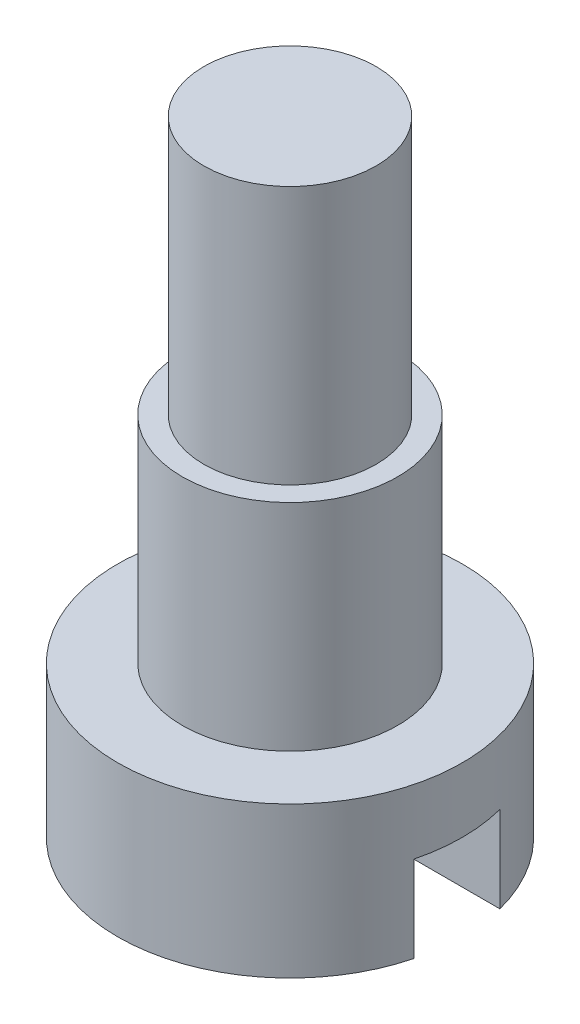
ISO-10303-21;
HEADER;
FILE_DESCRIPTION(('STEP AP214'),'2;1');
FILE_NAME('part.step','',(''),(''),'','','');
FILE_SCHEMA(('AUTOMOTIVE_DESIGN { 1 0 10303 214 1 1 1 1 }'));
ENDSEC;
DATA;
#1=APPLICATION_CONTEXT('core data for automotive mechanical design processes');
#2=APPLICATION_PROTOCOL_DEFINITION('international standard','automotive_design',2000,#1);
#3=PRODUCT_CONTEXT('',#1,'mechanical');
#4=PRODUCT('Part','Part','',(#3));
#5=PRODUCT_RELATED_PRODUCT_CATEGORY('part','',(#4));
#6=PRODUCT_DEFINITION_FORMATION('','',#4);
#7=PRODUCT_DEFINITION_CONTEXT('part definition',#1,'design');
#8=PRODUCT_DEFINITION('design','',#6,#7);
#9=PRODUCT_DEFINITION_SHAPE('','',#8);
#10=(LENGTH_UNIT() NAMED_UNIT(*) SI_UNIT(.MILLI.,.METRE.));
#11=(NAMED_UNIT(*) PLANE_ANGLE_UNIT() SI_UNIT($,.RADIAN.));
#12=(NAMED_UNIT(*) SI_UNIT($,.STERADIAN.) SOLID_ANGLE_UNIT());
#13=UNCERTAINTY_MEASURE_WITH_UNIT(LENGTH_MEASURE(1.E-05),#10,'distance_accuracy_value','');
#14=(GEOMETRIC_REPRESENTATION_CONTEXT(3) GLOBAL_UNCERTAINTY_ASSIGNED_CONTEXT((#13)) GLOBAL_UNIT_ASSIGNED_CONTEXT((#10,
#11,#12)) REPRESENTATION_CONTEXT('',''));
#15=CARTESIAN_POINT('',(0.,0.,0.));
#16=DIRECTION('',(0.,0.,1.));
#17=DIRECTION('',(1.,0.,0.));
#18=AXIS2_PLACEMENT_3D('',#15,#16,#17);
#19=CARTESIAN_POINT('',(0.,-7.,0.));
#20=DIRECTION('',(0.,1.,0.));
#21=DIRECTION('',(0.,0.,1.));
#22=AXIS2_PLACEMENT_3D('',#19,#20,#21);
#23=CYLINDRICAL_SURFACE('',#22,8.);
#24=CARTESIAN_POINT('',(0.,0.,0.));
#25=DIRECTION('',(0.,1.,0.));
#26=DIRECTION('',(0.,0.,1.));
#27=AXIS2_PLACEMENT_3D('',#24,#25,#26);
#28=CIRCLE('',#27,8.);
#29=CARTESIAN_POINT('',(0.,0.,8.));
#30=VERTEX_POINT('',#29);
#31=EDGE_CURVE('E113',#30,#30,#28,.T.);
#32=ORIENTED_EDGE('',*,*,#31,.F.);
#33=EDGE_LOOP('',(#32));
#34=FACE_BOUND('',#33,.T.);
#35=CARTESIAN_POINT('',(0.,-7.,0.));
#36=DIRECTION('',(0.,1.,0.));
#37=DIRECTION('',(0.,0.,1.));
#38=AXIS2_PLACEMENT_3D('',#35,#36,#37);
#39=CIRCLE('',#38,8.);
#40=CARTESIAN_POINT('',(7.74596669241483,-7.,-2.));
#41=VERTEX_POINT('',#40);
#42=CARTESIAN_POINT('',(-7.74596669241484,-7.,-2.));
#43=VERTEX_POINT('',#42);
#44=EDGE_CURVE('E117',#41,#43,#39,.T.);
#45=ORIENTED_EDGE('',*,*,#44,.T.);
#46=DIRECTION('',(0.,1.,0.));
#47=VECTOR('',#46,1.);
#48=CARTESIAN_POINT('',(-7.74596669241483,-7.,-2.));
#49=LINE('',#48,#47);
#50=CARTESIAN_POINT('',(-7.74596669241483,-3.,-2.));
#51=VERTEX_POINT('',#50);
#52=EDGE_CURVE('E101',#43,#51,#49,.T.);
#53=ORIENTED_EDGE('',*,*,#52,.T.);
#54=CARTESIAN_POINT('',(0.,-3.,0.));
#55=DIRECTION('',(0.,-1.,0.));
#56=DIRECTION('',(0.,0.,-1.));
#57=AXIS2_PLACEMENT_3D('',#54,#55,#56);
#58=CIRCLE('',#57,8.);
#59=CARTESIAN_POINT('',(-7.74596669241484,-3.,2.));
#60=VERTEX_POINT('',#59);
#61=EDGE_CURVE('E13',#51,#60,#58,.F.);
#62=ORIENTED_EDGE('',*,*,#61,.T.);
#63=DIRECTION('',(0.,1.,0.));
#64=VECTOR('',#63,1.);
#65=CARTESIAN_POINT('',(-7.74596669241483,-7.,2.));
#66=LINE('',#65,#64);
#67=CARTESIAN_POINT('',(-7.74596669241484,-7.,2.));
#68=VERTEX_POINT('',#67);
#69=EDGE_CURVE('E93',#60,#68,#66,.F.);
#70=ORIENTED_EDGE('',*,*,#69,.T.);
#71=CARTESIAN_POINT('',(7.74596669241483,-7.,2.));
#72=VERTEX_POINT('',#71);
#73=EDGE_CURVE('E99',#68,#72,#39,.T.);
#74=ORIENTED_EDGE('',*,*,#73,.T.);
#75=DIRECTION('',(0.,1.,0.));
#76=VECTOR('',#75,1.);
#77=CARTESIAN_POINT('',(7.74596669241483,-7.,2.));
#78=LINE('',#77,#76);
#79=CARTESIAN_POINT('',(7.74596669241483,-3.,2.));
#80=VERTEX_POINT('',#79);
#81=EDGE_CURVE('E60',#72,#80,#78,.T.);
#82=ORIENTED_EDGE('',*,*,#81,.T.);
#83=CARTESIAN_POINT('',(7.74596669241483,-3.,-2.));
#84=VERTEX_POINT('',#83);
#85=EDGE_CURVE('E49',#80,#84,#58,.F.);
#86=ORIENTED_EDGE('',*,*,#85,.T.);
#87=DIRECTION('',(0.,1.,0.));
#88=VECTOR('',#87,1.);
#89=CARTESIAN_POINT('',(7.74596669241483,-7.,-2.));
#90=LINE('',#89,#88);
#91=EDGE_CURVE('E107',#84,#41,#90,.F.);
#92=ORIENTED_EDGE('',*,*,#91,.T.);
#93=EDGE_LOOP('',(#45,#53,#62,#70,#74,#82,#86,#92));
#94=FACE_BOUND('',#93,.T.);
#95=ADVANCED_FACE('F46',(#34,#94),#23,.T.);
#96=CARTESIAN_POINT('',(0.,-7.,0.));
#97=DIRECTION('',(0.,1.,0.));
#98=DIRECTION('',(0.,0.,1.));
#99=AXIS2_PLACEMENT_3D('',#96,#97,#98);
#100=PLANE('',#99);
#101=DIRECTION('',(1.,0.,0.));
#102=VECTOR('',#101,1.);
#103=CARTESIAN_POINT('',(0.,-7.,-2.));
#104=LINE('',#103,#102);
#105=EDGE_CURVE('E90',#43,#41,#104,.T.);
#106=ORIENTED_EDGE('',*,*,#105,.F.);
#107=ORIENTED_EDGE('',*,*,#44,.F.);
#108=EDGE_LOOP('',(#106,#107));
#109=FACE_BOUND('',#108,.T.);
#110=ADVANCED_FACE('F126',(#109),#100,.F.);
#111=DIRECTION('',(-1.,0.,0.));
#112=VECTOR('',#111,1.);
#113=CARTESIAN_POINT('',(0.,-7.,2.));
#114=LINE('',#113,#112);
#115=EDGE_CURVE('E120',#72,#68,#114,.T.);
#116=ORIENTED_EDGE('',*,*,#115,.F.);
#117=ORIENTED_EDGE('',*,*,#73,.F.);
#118=EDGE_LOOP('',(#116,#117));
#119=FACE_BOUND('',#118,.T.);
#120=ADVANCED_FACE('F128',(#119),#100,.F.);
#121=CARTESIAN_POINT('',(0.,0.,0.));
#122=DIRECTION('',(0.,1.,0.));
#123=DIRECTION('',(0.,0.,1.));
#124=AXIS2_PLACEMENT_3D('',#121,#122,#123);
#125=PLANE('',#124);
#126=CARTESIAN_POINT('',(0.,0.,0.));
#127=DIRECTION('',(0.,1.,0.));
#128=DIRECTION('',(0.,0.,1.));
#129=AXIS2_PLACEMENT_3D('',#126,#127,#128);
#130=CIRCLE('',#129,5.);
#131=CARTESIAN_POINT('',(0.,0.,5.));
#132=VERTEX_POINT('',#131);
#133=EDGE_CURVE('E109',#132,#132,#130,.T.);
#134=ORIENTED_EDGE('',*,*,#133,.F.);
#135=EDGE_LOOP('',(#134));
#136=FACE_BOUND('',#135,.T.);
#137=ORIENTED_EDGE('',*,*,#31,.T.);
#138=EDGE_LOOP('',(#137));
#139=FACE_BOUND('',#138,.T.);
#140=ADVANCED_FACE('F134',(#136,#139),#125,.T.);
#141=CARTESIAN_POINT('',(0.,10.,0.));
#142=DIRECTION('',(0.,-1.,0.));
#143=DIRECTION('',(0.,0.,-1.));
#144=AXIS2_PLACEMENT_3D('',#141,#142,#143);
#145=CYLINDRICAL_SURFACE('',#144,5.);
#146=CARTESIAN_POINT('',(0.,10.,0.));
#147=DIRECTION('',(0.,1.,0.));
#148=DIRECTION('',(0.,0.,1.));
#149=AXIS2_PLACEMENT_3D('',#146,#147,#148);
#150=CIRCLE('',#149,5.);
#151=CARTESIAN_POINT('',(0.,10.,5.));
#152=VERTEX_POINT('',#151);
#153=EDGE_CURVE('E110',#152,#152,#150,.T.);
#154=ORIENTED_EDGE('',*,*,#153,.F.);
#155=EDGE_LOOP('',(#154));
#156=FACE_BOUND('',#155,.T.);
#157=ORIENTED_EDGE('',*,*,#133,.T.);
#158=EDGE_LOOP('',(#157));
#159=FACE_BOUND('',#158,.T.);
#160=ADVANCED_FACE('F138',(#156,#159),#145,.T.);
#161=CARTESIAN_POINT('',(0.,10.,0.));
#162=DIRECTION('',(0.,1.,0.));
#163=DIRECTION('',(0.,0.,1.));
#164=AXIS2_PLACEMENT_3D('',#161,#162,#163);
#165=PLANE('',#164);
#166=CARTESIAN_POINT('',(0.,10.,0.));
#167=DIRECTION('',(0.,1.,0.));
#168=DIRECTION('',(0.,0.,1.));
#169=AXIS2_PLACEMENT_3D('',#166,#167,#168);
#170=CIRCLE('',#169,4.);
#171=CARTESIAN_POINT('',(0.,10.,4.));
#172=VERTEX_POINT('',#171);
#173=EDGE_CURVE('E178',#172,#172,#170,.T.);
#174=ORIENTED_EDGE('',*,*,#173,.F.);
#175=EDGE_LOOP('',(#174));
#176=FACE_BOUND('',#175,.T.);
#177=ORIENTED_EDGE('',*,*,#153,.T.);
#178=EDGE_LOOP('',(#177));
#179=FACE_BOUND('',#178,.T.);
#180=ADVANCED_FACE('F145',(#176,#179),#165,.T.);
#181=CARTESIAN_POINT('',(10.,-3.,-2.));
#182=DIRECTION('',(0.,0.,1.));
#183=DIRECTION('',(0.,-1.,0.));
#184=AXIS2_PLACEMENT_3D('',#181,#182,#183);
#185=PLANE('',#184);
#186=DIRECTION('',(-1.,0.,0.));
#187=VECTOR('',#186,1.);
#188=CARTESIAN_POINT('',(10.,-3.,-2.));
#189=LINE('',#188,#187);
#190=EDGE_CURVE('E87',#84,#51,#189,.T.);
#191=ORIENTED_EDGE('',*,*,#190,.T.);
#192=ORIENTED_EDGE('',*,*,#52,.F.);
#193=ORIENTED_EDGE('',*,*,#105,.T.);
#194=ORIENTED_EDGE('',*,*,#91,.F.);
#195=EDGE_LOOP('',(#191,#192,#193,#194));
#196=FACE_BOUND('',#195,.T.);
#197=ADVANCED_FACE('F123',(#196),#185,.T.);
#198=CARTESIAN_POINT('',(10.,-3.,2.));
#199=DIRECTION('',(0.,-1.,0.));
#200=DIRECTION('',(0.,0.,-1.));
#201=AXIS2_PLACEMENT_3D('',#198,#199,#200);
#202=PLANE('',#201);
#203=ORIENTED_EDGE('',*,*,#190,.F.);
#204=ORIENTED_EDGE('',*,*,#85,.F.);
#205=DIRECTION('',(-1.,0.,0.));
#206=VECTOR('',#205,1.);
#207=CARTESIAN_POINT('',(10.,-3.,2.));
#208=LINE('',#207,#206);
#209=EDGE_CURVE('E86',#80,#60,#208,.T.);
#210=ORIENTED_EDGE('',*,*,#209,.T.);
#211=ORIENTED_EDGE('',*,*,#61,.F.);
#212=EDGE_LOOP('',(#203,#204,#210,#211));
#213=FACE_BOUND('',#212,.T.);
#214=ADVANCED_FACE('F85',(#213),#202,.T.);
#215=CARTESIAN_POINT('',(10.,-7.,2.));
#216=DIRECTION('',(0.,0.,-1.));
#217=DIRECTION('',(0.,1.,0.));
#218=AXIS2_PLACEMENT_3D('',#215,#216,#217);
#219=PLANE('',#218);
#220=ORIENTED_EDGE('',*,*,#209,.F.);
#221=ORIENTED_EDGE('',*,*,#81,.F.);
#222=ORIENTED_EDGE('',*,*,#115,.T.);
#223=ORIENTED_EDGE('',*,*,#69,.F.);
#224=EDGE_LOOP('',(#220,#221,#222,#223));
#225=FACE_BOUND('',#224,.T.);
#226=ADVANCED_FACE('F91',(#225),#219,.T.);
#227=CARTESIAN_POINT('',(0.,22.,0.));
#228=DIRECTION('',(0.,-1.,0.));
#229=DIRECTION('',(0.,0.,-1.));
#230=AXIS2_PLACEMENT_3D('',#227,#228,#229);
#231=CYLINDRICAL_SURFACE('',#230,4.);
#232=CARTESIAN_POINT('',(0.,22.,0.));
#233=DIRECTION('',(0.,1.,0.));
#234=DIRECTION('',(0.,0.,1.));
#235=AXIS2_PLACEMENT_3D('',#232,#233,#234);
#236=CIRCLE('',#235,4.);
#237=CARTESIAN_POINT('',(0.,22.,4.));
#238=VERTEX_POINT('',#237);
#239=EDGE_CURVE('E94',#238,#238,#236,.T.);
#240=ORIENTED_EDGE('',*,*,#239,.F.);
#241=EDGE_LOOP('',(#240));
#242=FACE_BOUND('',#241,.T.);
#243=ORIENTED_EDGE('',*,*,#173,.T.);
#244=EDGE_LOOP('',(#243));
#245=FACE_BOUND('',#244,.T.);
#246=ADVANCED_FACE('F167',(#242,#245),#231,.T.);
#247=CARTESIAN_POINT('',(0.,22.,0.));
#248=DIRECTION('',(0.,1.,0.));
#249=DIRECTION('',(0.,0.,1.));
#250=AXIS2_PLACEMENT_3D('',#247,#248,#249);
#251=PLANE('',#250);
#252=ORIENTED_EDGE('',*,*,#239,.T.);
#253=EDGE_LOOP('',(#252));
#254=FACE_BOUND('',#253,.T.);
#255=ADVANCED_FACE('F170',(#254),#251,.T.);
#256=CLOSED_SHELL('',(#95,#110,#120,#140,#160,#180,#197,#214,#226,#246,#255));
#257=MANIFOLD_SOLID_BREP('B2',#256);
#258=ADVANCED_BREP_SHAPE_REPRESENTATION('',(#18,#257),#14);
#259=SHAPE_DEFINITION_REPRESENTATION(#9,#258);
ENDSEC;
END-ISO-10303-21;
